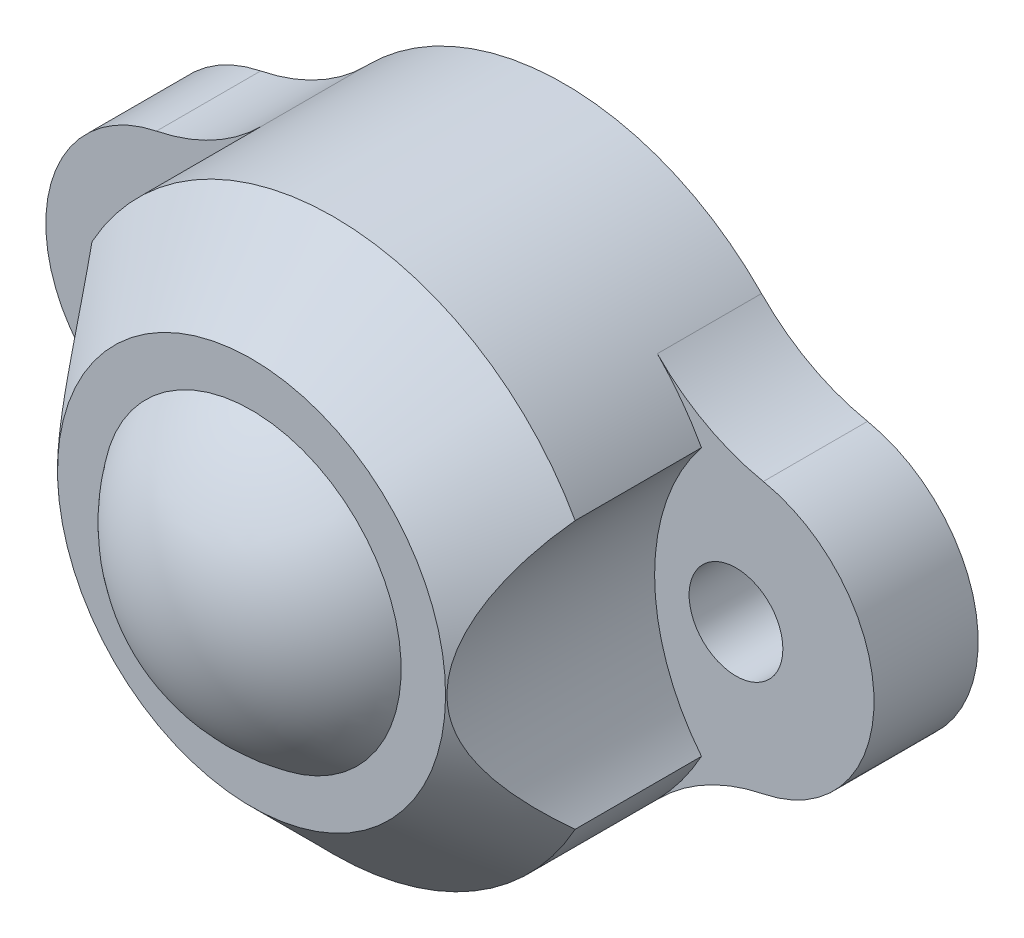
ISO-10303-21;
HEADER;
FILE_DESCRIPTION(('STEP AP214'),'2;1');
FILE_NAME('part.step','',(''),(''),'','','');
FILE_SCHEMA(('AUTOMOTIVE_DESIGN { 1 0 10303 214 1 1 1 1 }'));
ENDSEC;
DATA;
#1=APPLICATION_CONTEXT('core data for automotive mechanical design processes');
#2=APPLICATION_PROTOCOL_DEFINITION('international standard','automotive_design',2000,#1);
#3=PRODUCT_CONTEXT('',#1,'mechanical');
#4=PRODUCT('Part','Part','',(#3));
#5=PRODUCT_RELATED_PRODUCT_CATEGORY('part','',(#4));
#6=PRODUCT_DEFINITION_FORMATION('','',#4);
#7=PRODUCT_DEFINITION_CONTEXT('part definition',#1,'design');
#8=PRODUCT_DEFINITION('design','',#6,#7);
#9=PRODUCT_DEFINITION_SHAPE('','',#8);
#10=(LENGTH_UNIT() NAMED_UNIT(*) SI_UNIT(.MILLI.,.METRE.));
#11=(NAMED_UNIT(*) PLANE_ANGLE_UNIT() SI_UNIT($,.RADIAN.));
#12=(NAMED_UNIT(*) SI_UNIT($,.STERADIAN.) SOLID_ANGLE_UNIT());
#13=UNCERTAINTY_MEASURE_WITH_UNIT(LENGTH_MEASURE(1.E-05),#10,'distance_accuracy_value','');
#14=(GEOMETRIC_REPRESENTATION_CONTEXT(3) GLOBAL_UNCERTAINTY_ASSIGNED_CONTEXT((#13)) GLOBAL_UNIT_ASSIGNED_CONTEXT((#10,
#11,#12)) REPRESENTATION_CONTEXT('',''));
#15=CARTESIAN_POINT('',(0.,0.,0.));
#16=DIRECTION('',(0.,0.,1.));
#17=DIRECTION('',(1.,0.,0.));
#18=AXIS2_PLACEMENT_3D('',#15,#16,#17);
#19=CARTESIAN_POINT('',(-3.3655,0.,2.54));
#20=DIRECTION('',(0.,0.,1.));
#21=DIRECTION('',(1.,0.,0.));
#22=AXIS2_PLACEMENT_3D('',#19,#20,#21);
#23=PLANE('',#22);
#24=CARTESIAN_POINT('',(6.731,0.,2.54));
#25=DIRECTION('',(0.,0.,1.));
#26=DIRECTION('',(1.,0.,0.));
#27=AXIS2_PLACEMENT_3D('',#24,#25,#26);
#28=CIRCLE('',#27,1.143);
#29=CARTESIAN_POINT('',(7.874,0.,2.54));
#30=VERTEX_POINT('',#29);
#31=EDGE_CURVE('E165',#30,#30,#28,.T.);
#32=ORIENTED_EDGE('',*,*,#31,.F.);
#33=EDGE_LOOP('',(#32));
#34=FACE_BOUND('',#33,.T.);
#35=CARTESIAN_POINT('',(9.96381315724373,0.,2.54));
#36=DIRECTION('',(0.,0.,-1.));
#37=DIRECTION('',(-1.,0.,0.));
#38=AXIS2_PLACEMENT_3D('',#35,#36,#37);
#39=CIRCLE('',#38,5.21705736023671);
#40=CARTESIAN_POINT('',(5.889625,-3.25863136291527,2.54));
#41=VERTEX_POINT('',#40);
#42=CARTESIAN_POINT('',(5.889625,3.25863136291527,2.54));
#43=VERTEX_POINT('',#42);
#44=EDGE_CURVE('E156',#41,#43,#39,.T.);
#45=ORIENTED_EDGE('',*,*,#44,.F.);
#46=CARTESIAN_POINT('',(0.,0.,2.54));
#47=DIRECTION('',(0.,0.,1.));
#48=DIRECTION('',(1.,0.,0.));
#49=AXIS2_PLACEMENT_3D('',#46,#47,#48);
#50=CIRCLE('',#49,6.731);
#51=CARTESIAN_POINT('',(4.8137896065979,-4.7046562704846,2.54));
#52=VERTEX_POINT('',#51);
#53=EDGE_CURVE('E216',#52,#41,#50,.T.);
#54=ORIENTED_EDGE('',*,*,#53,.F.);
#55=CARTESIAN_POINT('',(8.389625,-8.19942396509505,2.54));
#56=DIRECTION('',(0.,0.,1.));
#57=DIRECTION('',(1.,0.,0.));
#58=AXIS2_PLACEMENT_3D('',#55,#56,#57);
#59=CIRCLE('',#58,5.);
#60=CARTESIAN_POINT('',(7.39827660480545,-3.29868643291225,2.54));
#61=VERTEX_POINT('',#60);
#62=EDGE_CURVE('E232',#52,#61,#59,.F.);
#63=ORIENTED_EDGE('',*,*,#62,.T.);
#64=CARTESIAN_POINT('',(6.731,0.,2.54));
#65=DIRECTION('',(0.,0.,1.));
#66=DIRECTION('',(1.,0.,0.));
#67=AXIS2_PLACEMENT_3D('',#64,#65,#66);
#68=CIRCLE('',#67,3.3655);
#69=CARTESIAN_POINT('',(7.39827660480545,3.29868643291225,2.54));
#70=VERTEX_POINT('',#69);
#71=EDGE_CURVE('E180',#61,#70,#68,.T.);
#72=ORIENTED_EDGE('',*,*,#71,.T.);
#73=CARTESIAN_POINT('',(8.389625,8.19942396509505,2.54));
#74=DIRECTION('',(0.,0.,1.));
#75=DIRECTION('',(1.,0.,0.));
#76=AXIS2_PLACEMENT_3D('',#73,#74,#75);
#77=CIRCLE('',#76,5.);
#78=CARTESIAN_POINT('',(4.8137896065979,4.7046562704846,2.54));
#79=VERTEX_POINT('',#78);
#80=EDGE_CURVE('E228',#70,#79,#77,.F.);
#81=ORIENTED_EDGE('',*,*,#80,.T.);
#82=CARTESIAN_POINT('',(0.,0.,2.54));
#83=DIRECTION('',(0.,0.,1.));
#84=DIRECTION('',(1.,0.,0.));
#85=AXIS2_PLACEMENT_3D('',#82,#83,#84);
#86=CIRCLE('',#85,6.731);
#87=EDGE_CURVE('E201',#43,#79,#86,.T.);
#88=ORIENTED_EDGE('',*,*,#87,.F.);
#89=EDGE_LOOP('',(#45,#54,#63,#72,#81,#88));
#90=FACE_BOUND('',#89,.T.);
#91=ADVANCED_FACE('F37',(#34,#90),#23,.T.);
#92=CARTESIAN_POINT('',(-6.731,0.,2.54));
#93=DIRECTION('',(0.,0.,1.));
#94=DIRECTION('',(1.,0.,0.));
#95=AXIS2_PLACEMENT_3D('',#92,#93,#94);
#96=CIRCLE('',#95,1.143);
#97=CARTESIAN_POINT('',(-5.588,0.,2.54));
#98=VERTEX_POINT('',#97);
#99=EDGE_CURVE('E171',#98,#98,#96,.T.);
#100=ORIENTED_EDGE('',*,*,#99,.F.);
#101=EDGE_LOOP('',(#100));
#102=FACE_BOUND('',#101,.T.);
#103=CARTESIAN_POINT('',(-9.96381315724373,0.,2.54));
#104=DIRECTION('',(0.,0.,-1.));
#105=DIRECTION('',(1.,0.,0.));
#106=AXIS2_PLACEMENT_3D('',#103,#104,#105);
#107=CIRCLE('',#106,5.21705736023671);
#108=CARTESIAN_POINT('',(-5.889625,3.25863136291527,2.54));
#109=VERTEX_POINT('',#108);
#110=CARTESIAN_POINT('',(-5.889625,-3.25863136291527,2.54));
#111=VERTEX_POINT('',#110);
#112=EDGE_CURVE('E136',#109,#111,#107,.T.);
#113=ORIENTED_EDGE('',*,*,#112,.F.);
#114=CARTESIAN_POINT('',(0.,0.,2.54));
#115=DIRECTION('',(0.,0.,1.));
#116=DIRECTION('',(1.,0.,0.));
#117=AXIS2_PLACEMENT_3D('',#114,#115,#116);
#118=CIRCLE('',#117,6.731);
#119=CARTESIAN_POINT('',(-4.8137896065979,4.7046562704846,2.54));
#120=VERTEX_POINT('',#119);
#121=EDGE_CURVE('E142',#120,#109,#118,.T.);
#122=ORIENTED_EDGE('',*,*,#121,.F.);
#123=CARTESIAN_POINT('',(-8.389625,8.19942396509505,2.54));
#124=DIRECTION('',(0.,0.,1.));
#125=DIRECTION('',(1.,0.,0.));
#126=AXIS2_PLACEMENT_3D('',#123,#124,#125);
#127=CIRCLE('',#126,5.);
#128=CARTESIAN_POINT('',(-7.39827660480545,3.29868643291225,2.54));
#129=VERTEX_POINT('',#128);
#130=EDGE_CURVE('E224',#120,#129,#127,.F.);
#131=ORIENTED_EDGE('',*,*,#130,.T.);
#132=CARTESIAN_POINT('',(-6.731,0.,2.54));
#133=DIRECTION('',(0.,0.,1.));
#134=DIRECTION('',(1.,0.,0.));
#135=AXIS2_PLACEMENT_3D('',#132,#133,#134);
#136=CIRCLE('',#135,3.3655);
#137=CARTESIAN_POINT('',(-7.39827660480545,-3.29868643291225,2.54));
#138=VERTEX_POINT('',#137);
#139=EDGE_CURVE('E177',#129,#138,#136,.T.);
#140=ORIENTED_EDGE('',*,*,#139,.T.);
#141=CARTESIAN_POINT('',(-8.389625,-8.19942396509505,2.54));
#142=DIRECTION('',(0.,0.,1.));
#143=DIRECTION('',(1.,0.,0.));
#144=AXIS2_PLACEMENT_3D('',#141,#142,#143);
#145=CIRCLE('',#144,5.);
#146=CARTESIAN_POINT('',(-4.8137896065979,-4.7046562704846,2.54));
#147=VERTEX_POINT('',#146);
#148=EDGE_CURVE('E236',#138,#147,#145,.F.);
#149=ORIENTED_EDGE('',*,*,#148,.T.);
#150=CARTESIAN_POINT('',(0.,0.,2.54));
#151=DIRECTION('',(0.,0.,1.));
#152=DIRECTION('',(1.,0.,0.));
#153=AXIS2_PLACEMENT_3D('',#150,#151,#152);
#154=CIRCLE('',#153,6.731);
#155=EDGE_CURVE('E154',#111,#147,#154,.T.);
#156=ORIENTED_EDGE('',*,*,#155,.F.);
#157=EDGE_LOOP('',(#113,#122,#131,#140,#149,#156));
#158=FACE_BOUND('',#157,.T.);
#159=ADVANCED_FACE('F152',(#102,#158),#23,.T.);
#160=CARTESIAN_POINT('',(-3.3655,0.,0.));
#161=DIRECTION('',(0.,0.,1.));
#162=DIRECTION('',(1.,0.,0.));
#163=AXIS2_PLACEMENT_3D('',#160,#161,#162);
#164=PLANE('',#163);
#165=CARTESIAN_POINT('',(0.,0.,0.));
#166=DIRECTION('',(0.,0.,1.));
#167=DIRECTION('',(1.,0.,0.));
#168=AXIS2_PLACEMENT_3D('',#165,#166,#167);
#169=CIRCLE('',#168,6.731);
#170=CARTESIAN_POINT('',(4.8137896065979,4.7046562704846,0.));
#171=VERTEX_POINT('',#170);
#172=CARTESIAN_POINT('',(-4.8137896065979,4.7046562704846,0.));
#173=VERTEX_POINT('',#172);
#174=EDGE_CURVE('E174',#171,#173,#169,.T.);
#175=ORIENTED_EDGE('',*,*,#174,.F.);
#176=CARTESIAN_POINT('',(8.389625,8.19942396509505,0.));
#177=DIRECTION('',(0.,0.,1.));
#178=DIRECTION('',(1.,0.,0.));
#179=AXIS2_PLACEMENT_3D('',#176,#177,#178);
#180=CIRCLE('',#179,5.);
#181=CARTESIAN_POINT('',(7.39827660480545,3.29868643291225,0.));
#182=VERTEX_POINT('',#181);
#183=EDGE_CURVE('E226',#171,#182,#180,.T.);
#184=ORIENTED_EDGE('',*,*,#183,.T.);
#185=CARTESIAN_POINT('',(6.731,0.,0.));
#186=DIRECTION('',(0.,0.,1.));
#187=DIRECTION('',(1.,0.,0.));
#188=AXIS2_PLACEMENT_3D('',#185,#186,#187);
#189=CIRCLE('',#188,3.3655);
#190=CARTESIAN_POINT('',(7.39827660480545,-3.29868643291225,0.));
#191=VERTEX_POINT('',#190);
#192=EDGE_CURVE('E181',#191,#182,#189,.T.);
#193=ORIENTED_EDGE('',*,*,#192,.F.);
#194=CARTESIAN_POINT('',(8.389625,-8.19942396509505,0.));
#195=DIRECTION('',(0.,0.,1.));
#196=DIRECTION('',(1.,0.,0.));
#197=AXIS2_PLACEMENT_3D('',#194,#195,#196);
#198=CIRCLE('',#197,5.);
#199=CARTESIAN_POINT('',(4.8137896065979,-4.7046562704846,0.));
#200=VERTEX_POINT('',#199);
#201=EDGE_CURVE('E230',#191,#200,#198,.T.);
#202=ORIENTED_EDGE('',*,*,#201,.T.);
#203=CARTESIAN_POINT('',(0.,0.,0.));
#204=DIRECTION('',(0.,0.,1.));
#205=DIRECTION('',(1.,0.,0.));
#206=AXIS2_PLACEMENT_3D('',#203,#204,#205);
#207=CIRCLE('',#206,6.731);
#208=CARTESIAN_POINT('',(-4.8137896065979,-4.7046562704846,0.));
#209=VERTEX_POINT('',#208);
#210=EDGE_CURVE('E189',#209,#200,#207,.T.);
#211=ORIENTED_EDGE('',*,*,#210,.F.);
#212=CARTESIAN_POINT('',(-8.389625,-8.19942396509505,0.));
#213=DIRECTION('',(0.,0.,1.));
#214=DIRECTION('',(1.,0.,0.));
#215=AXIS2_PLACEMENT_3D('',#212,#213,#214);
#216=CIRCLE('',#215,5.);
#217=CARTESIAN_POINT('',(-7.39827660480545,-3.29868643291225,0.));
#218=VERTEX_POINT('',#217);
#219=EDGE_CURVE('E234',#209,#218,#216,.T.);
#220=ORIENTED_EDGE('',*,*,#219,.T.);
#221=CARTESIAN_POINT('',(-6.731,0.,0.));
#222=DIRECTION('',(0.,0.,1.));
#223=DIRECTION('',(1.,0.,0.));
#224=AXIS2_PLACEMENT_3D('',#221,#222,#223);
#225=CIRCLE('',#224,3.3655);
#226=CARTESIAN_POINT('',(-7.39827660480545,3.29868643291225,0.));
#227=VERTEX_POINT('',#226);
#228=EDGE_CURVE('E186',#227,#218,#225,.T.);
#229=ORIENTED_EDGE('',*,*,#228,.F.);
#230=CARTESIAN_POINT('',(-8.389625,8.19942396509505,0.));
#231=DIRECTION('',(0.,0.,1.));
#232=DIRECTION('',(1.,0.,0.));
#233=AXIS2_PLACEMENT_3D('',#230,#231,#232);
#234=CIRCLE('',#233,5.);
#235=EDGE_CURVE('E222',#227,#173,#234,.T.);
#236=ORIENTED_EDGE('',*,*,#235,.T.);
#237=EDGE_LOOP('',(#175,#184,#193,#202,#211,#220,#229,#236));
#238=FACE_BOUND('',#237,.T.);
#239=CARTESIAN_POINT('',(-6.731,0.,0.));
#240=DIRECTION('',(0.,0.,1.));
#241=DIRECTION('',(1.,0.,0.));
#242=AXIS2_PLACEMENT_3D('',#239,#240,#241);
#243=CIRCLE('',#242,1.143);
#244=CARTESIAN_POINT('',(-5.588,0.,0.));
#245=VERTEX_POINT('',#244);
#246=EDGE_CURVE('E168',#245,#245,#243,.T.);
#247=ORIENTED_EDGE('',*,*,#246,.T.);
#248=EDGE_LOOP('',(#247));
#249=FACE_BOUND('',#248,.T.);
#250=CARTESIAN_POINT('',(6.731,0.,0.));
#251=DIRECTION('',(0.,0.,1.));
#252=DIRECTION('',(1.,0.,0.));
#253=AXIS2_PLACEMENT_3D('',#250,#251,#252);
#254=CIRCLE('',#253,1.143);
#255=CARTESIAN_POINT('',(7.874,0.,0.));
#256=VERTEX_POINT('',#255);
#257=EDGE_CURVE('E164',#256,#256,#254,.T.);
#258=ORIENTED_EDGE('',*,*,#257,.T.);
#259=EDGE_LOOP('',(#258));
#260=FACE_BOUND('',#259,.T.);
#261=ADVANCED_FACE('F268',(#238,#249,#260),#164,.F.);
#262=CARTESIAN_POINT('',(0.,0.,2.54));
#263=DIRECTION('',(0.,0.,-1.));
#264=DIRECTION('',(-1.,0.,0.));
#265=AXIS2_PLACEMENT_3D('',#262,#263,#264);
#266=CYLINDRICAL_SURFACE('',#265,6.731);
#267=DIRECTION('',(0.,0.,-1.));
#268=VECTOR('',#267,1.);
#269=CARTESIAN_POINT('',(-5.889625,3.25863136291527,7.62));
#270=LINE('',#269,#268);
#271=CARTESIAN_POINT('',(-5.889625,3.25863136291527,5.61999999999999));
#272=VERTEX_POINT('',#271);
#273=EDGE_CURVE('E131',#272,#109,#270,.T.);
#274=ORIENTED_EDGE('',*,*,#273,.F.);
#275=CARTESIAN_POINT('',(0.,0.,5.61999999999999));
#276=DIRECTION('',(0.,0.,-1.));
#277=DIRECTION('',(-1.,0.,0.));
#278=AXIS2_PLACEMENT_3D('',#275,#276,#277);
#279=CIRCLE('',#278,6.731);
#280=CARTESIAN_POINT('',(5.889625,3.25863136291527,5.61999999999999));
#281=VERTEX_POINT('',#280);
#282=EDGE_CURVE('E50',#272,#281,#279,.T.);
#283=ORIENTED_EDGE('',*,*,#282,.T.);
#284=DIRECTION('',(0.,0.,-1.));
#285=VECTOR('',#284,1.);
#286=CARTESIAN_POINT('',(5.889625,3.25863136291527,7.62));
#287=LINE('',#286,#285);
#288=EDGE_CURVE('E138',#281,#43,#287,.T.);
#289=ORIENTED_EDGE('',*,*,#288,.T.);
#290=ORIENTED_EDGE('',*,*,#87,.T.);
#291=DIRECTION('',(0.,0.,-1.));
#292=VECTOR('',#291,1.);
#293=CARTESIAN_POINT('',(4.8137896065979,4.7046562704846,2.54));
#294=LINE('',#293,#292);
#295=EDGE_CURVE('E149',#79,#171,#294,.T.);
#296=ORIENTED_EDGE('',*,*,#295,.T.);
#297=ORIENTED_EDGE('',*,*,#174,.T.);
#298=DIRECTION('',(0.,0.,-1.));
#299=VECTOR('',#298,1.);
#300=CARTESIAN_POINT('',(-4.8137896065979,4.7046562704846,2.54));
#301=LINE('',#300,#299);
#302=EDGE_CURVE('E146',#173,#120,#301,.F.);
#303=ORIENTED_EDGE('',*,*,#302,.T.);
#304=ORIENTED_EDGE('',*,*,#121,.T.);
#305=EDGE_LOOP('',(#274,#283,#289,#290,#296,#297,#303,#304));
#306=FACE_BOUND('',#305,.T.);
#307=ADVANCED_FACE('F143',(#306),#266,.T.);
#308=CARTESIAN_POINT('',(-6.731,0.,2.54));
#309=DIRECTION('',(0.,0.,-1.));
#310=DIRECTION('',(-1.,0.,0.));
#311=AXIS2_PLACEMENT_3D('',#308,#309,#310);
#312=CYLINDRICAL_SURFACE('',#311,3.3655);
#313=ORIENTED_EDGE('',*,*,#139,.F.);
#314=DIRECTION('',(0.,0.,-1.));
#315=VECTOR('',#314,1.);
#316=CARTESIAN_POINT('',(-7.39827660480545,3.29868643291225,2.54));
#317=LINE('',#316,#315);
#318=EDGE_CURVE('E198',#129,#227,#317,.T.);
#319=ORIENTED_EDGE('',*,*,#318,.T.);
#320=ORIENTED_EDGE('',*,*,#228,.T.);
#321=DIRECTION('',(0.,0.,-1.));
#322=VECTOR('',#321,1.);
#323=CARTESIAN_POINT('',(-7.39827660480545,-3.29868643291225,2.54));
#324=LINE('',#323,#322);
#325=EDGE_CURVE('E196',#218,#138,#324,.F.);
#326=ORIENTED_EDGE('',*,*,#325,.T.);
#327=EDGE_LOOP('',(#313,#319,#320,#326));
#328=FACE_BOUND('',#327,.T.);
#329=ADVANCED_FACE('F278',(#328),#312,.T.);
#330=CARTESIAN_POINT('',(0.,0.,2.54));
#331=DIRECTION('',(0.,0.,-1.));
#332=DIRECTION('',(-1.,0.,0.));
#333=AXIS2_PLACEMENT_3D('',#330,#331,#332);
#334=CYLINDRICAL_SURFACE('',#333,6.731);
#335=DIRECTION('',(0.,0.,-1.));
#336=VECTOR('',#335,1.);
#337=CARTESIAN_POINT('',(5.889625,-3.25863136291527,7.62));
#338=LINE('',#337,#336);
#339=CARTESIAN_POINT('',(5.889625,-3.25863136291527,5.62000000000006));
#340=VERTEX_POINT('',#339);
#341=EDGE_CURVE('E155',#340,#41,#338,.T.);
#342=ORIENTED_EDGE('',*,*,#341,.F.);
#343=CARTESIAN_POINT('',(0.,0.,5.61999999999999));
#344=DIRECTION('',(0.,0.,-1.));
#345=DIRECTION('',(-1.,0.,0.));
#346=AXIS2_PLACEMENT_3D('',#343,#344,#345);
#347=CIRCLE('',#346,6.731);
#348=CARTESIAN_POINT('',(-5.889625,-3.25863136291527,5.61999999999999));
#349=VERTEX_POINT('',#348);
#350=EDGE_CURVE('E239',#340,#349,#347,.T.);
#351=ORIENTED_EDGE('',*,*,#350,.T.);
#352=DIRECTION('',(0.,0.,-1.));
#353=VECTOR('',#352,1.);
#354=CARTESIAN_POINT('',(-5.889625,-3.25863136291527,7.62));
#355=LINE('',#354,#353);
#356=EDGE_CURVE('E139',#349,#111,#355,.T.);
#357=ORIENTED_EDGE('',*,*,#356,.T.);
#358=ORIENTED_EDGE('',*,*,#155,.T.);
#359=DIRECTION('',(0.,0.,-1.));
#360=VECTOR('',#359,1.);
#361=CARTESIAN_POINT('',(-4.8137896065979,-4.7046562704846,2.54));
#362=LINE('',#361,#360);
#363=EDGE_CURVE('E213',#147,#209,#362,.T.);
#364=ORIENTED_EDGE('',*,*,#363,.T.);
#365=ORIENTED_EDGE('',*,*,#210,.T.);
#366=DIRECTION('',(0.,0.,-1.));
#367=VECTOR('',#366,1.);
#368=CARTESIAN_POINT('',(4.8137896065979,-4.7046562704846,2.54));
#369=LINE('',#368,#367);
#370=EDGE_CURVE('E219',#200,#52,#369,.F.);
#371=ORIENTED_EDGE('',*,*,#370,.T.);
#372=ORIENTED_EDGE('',*,*,#53,.T.);
#373=EDGE_LOOP('',(#342,#351,#357,#358,#364,#365,#371,#372));
#374=FACE_BOUND('',#373,.T.);
#375=ADVANCED_FACE('F274',(#374),#334,.T.);
#376=CARTESIAN_POINT('',(6.731,0.,2.54));
#377=DIRECTION('',(0.,0.,-1.));
#378=DIRECTION('',(-1.,0.,0.));
#379=AXIS2_PLACEMENT_3D('',#376,#377,#378);
#380=CYLINDRICAL_SURFACE('',#379,3.3655);
#381=ORIENTED_EDGE('',*,*,#192,.T.);
#382=DIRECTION('',(0.,0.,-1.));
#383=VECTOR('',#382,1.);
#384=CARTESIAN_POINT('',(7.39827660480545,3.29868643291225,2.54));
#385=LINE('',#384,#383);
#386=EDGE_CURVE('E210',#182,#70,#385,.F.);
#387=ORIENTED_EDGE('',*,*,#386,.T.);
#388=ORIENTED_EDGE('',*,*,#71,.F.);
#389=DIRECTION('',(0.,0.,-1.));
#390=VECTOR('',#389,1.);
#391=CARTESIAN_POINT('',(7.39827660480545,-3.29868643291225,2.54));
#392=LINE('',#391,#390);
#393=EDGE_CURVE('E207',#61,#191,#392,.T.);
#394=ORIENTED_EDGE('',*,*,#393,.T.);
#395=EDGE_LOOP('',(#381,#387,#388,#394));
#396=FACE_BOUND('',#395,.T.);
#397=ADVANCED_FACE('F263',(#396),#380,.T.);
#398=CARTESIAN_POINT('',(-6.731,0.,2.54));
#399=DIRECTION('',(0.,0.,-1.));
#400=DIRECTION('',(-1.,0.,0.));
#401=AXIS2_PLACEMENT_3D('',#398,#399,#400);
#402=CYLINDRICAL_SURFACE('',#401,1.143);
#403=ORIENTED_EDGE('',*,*,#99,.T.);
#404=EDGE_LOOP('',(#403));
#405=FACE_BOUND('',#404,.T.);
#406=ORIENTED_EDGE('',*,*,#246,.F.);
#407=EDGE_LOOP('',(#406));
#408=FACE_BOUND('',#407,.T.);
#409=ADVANCED_FACE('F259',(#405,#408),#402,.F.);
#410=CARTESIAN_POINT('',(6.731,0.,2.54));
#411=DIRECTION('',(0.,0.,-1.));
#412=DIRECTION('',(-1.,0.,0.));
#413=AXIS2_PLACEMENT_3D('',#410,#411,#412);
#414=CYLINDRICAL_SURFACE('',#413,1.143);
#415=ORIENTED_EDGE('',*,*,#31,.T.);
#416=EDGE_LOOP('',(#415));
#417=FACE_BOUND('',#416,.T.);
#418=ORIENTED_EDGE('',*,*,#257,.F.);
#419=EDGE_LOOP('',(#418));
#420=FACE_BOUND('',#419,.T.);
#421=ADVANCED_FACE('F255',(#417,#420),#414,.F.);
#422=CARTESIAN_POINT('',(9.96381315724373,0.,7.62));
#423=DIRECTION('',(0.,0.,-1.));
#424=DIRECTION('',(-1.,0.,0.));
#425=AXIS2_PLACEMENT_3D('',#422,#423,#424);
#426=CYLINDRICAL_SURFACE('',#425,5.21705736023671);
#427=ORIENTED_EDGE('',*,*,#288,.F.);
#428=CARTESIAN_POINT('',(5.889625,3.25863136291527,5.61999999999999));
#429=CARTESIAN_POINT('',(5.85186598769293,3.21141976454037,5.67589309072123));
#430=CARTESIAN_POINT('',(5.81476696504133,3.16335618640523,5.73150789218911));
#431=CARTESIAN_POINT('',(5.74192272000934,3.06546151424885,5.8420784023594));
#432=CARTESIAN_POINT('',(5.70617765922462,3.015630210615,5.89703403185796));
#433=CARTESIAN_POINT('',(5.60085446748525,2.86314162946394,6.06102333053936));
#434=CARTESIAN_POINT('',(5.53338587288681,2.75773552915929,6.16888646017654));
#435=CARTESIAN_POINT('',(5.40363445229679,2.53752245950714,6.3816457467042));
#436=CARTESIAN_POINT('',(5.3414360704946,2.42260580235929,6.48648039104259));
#437=CARTESIAN_POINT('',(5.2239965045222,2.18391982809885,6.68952967619423));
#438=CARTESIAN_POINT('',(5.16874694676357,2.06016145326533,6.78775221716029));
#439=CARTESIAN_POINT('',(5.06658389618765,1.80379513610964,6.97385670315782));
#440=CARTESIAN_POINT('',(5.01959398244953,1.67128585762043,7.06183059178024));
#441=CARTESIAN_POINT('',(4.93478946442931,1.39550018898942,7.22407961559049));
#442=CARTESIAN_POINT('',(4.89696113231895,1.25224033490945,7.29837520594148));
#443=CARTESIAN_POINT('',(4.83197921706732,0.951745964558499,7.42816301449603));
#444=CARTESIAN_POINT('',(4.80500928173202,0.794322037691265,7.48332971327298));
#445=CARTESIAN_POINT('',(4.77536924571675,0.55171603339234,7.54451462036162));
#446=CARTESIAN_POINT('',(4.76729446088302,0.469855992740416,7.56130920824298));
#447=CARTESIAN_POINT('',(4.75499809369391,0.304598237371093,7.58695671353878));
#448=CARTESIAN_POINT('',(4.75077549722451,0.221200933249966,7.59581172108962));
#449=CARTESIAN_POINT('',(4.74663873828431,0.0643433870921131,7.60448824144649));
#450=CARTESIAN_POINT('',(4.74625040968193,-0.00905054760639841,7.60530391507223));
#451=CARTESIAN_POINT('',(4.74856013538346,-0.15558580961644,7.60045828230687));
#452=CARTESIAN_POINT('',(4.75125922334812,-0.228727044099256,7.59479480670979));
#453=CARTESIAN_POINT('',(4.76389681249666,-0.446872052691331,7.56836193431834));
#454=CARTESIAN_POINT('',(4.77837689878139,-0.590546125438683,7.53814750626334));
#455=CARTESIAN_POINT('',(4.82224229520938,-0.900997101350528,7.44811232618468));
#456=CARTESIAN_POINT('',(4.85421407391124,-1.06586427345134,7.38322497502462));
#457=CARTESIAN_POINT('',(4.93061917121656,-1.382502389371,7.23227611453262));
#458=CARTESIAN_POINT('',(4.97508346904179,-1.53423953368715,7.14616203264799));
#459=CARTESIAN_POINT('',(5.06871289949225,-1.80955053873394,6.97006483820903));
#460=CARTESIAN_POINT('',(5.11686117134296,-1.93439916188169,6.88148916203805));
#461=CARTESIAN_POINT('',(5.22007326025857,-2.17526982908309,6.69659099549704));
#462=CARTESIAN_POINT('',(5.27514250423308,-2.29128483056188,6.60026244745498));
#463=CARTESIAN_POINT('',(5.39167986918211,-2.51582039548657,6.40176489551305));
#464=CARTESIAN_POINT('',(5.45317609709573,-2.62430426580177,6.29957120060666));
#465=CARTESIAN_POINT('',(5.58181633541269,-2.83388340488484,6.09134149488048));
#466=CARTESIAN_POINT('',(5.64895918335376,-2.93498018645287,5.98530627745599));
#467=CARTESIAN_POINT('',(5.83752415812074,-3.19894168436202,5.69506699035582));
#468=CARTESIAN_POINT('',(5.96396929974148,-3.35536107871374,5.50823019073632));
#469=CARTESIAN_POINT('',(6.23085905365125,-3.64996444205274,5.13004254896389));
#470=CARTESIAN_POINT('',(6.37131585219103,-3.78813229024797,4.93868788988405));
#471=CARTESIAN_POINT('',(6.66217219239553,-4.04395707016557,4.55760813376808));
#472=CARTESIAN_POINT('',(6.81231633830202,-4.16196929783284,4.36792712609931));
#473=CARTESIAN_POINT('',(7.04592738222436,-4.3258124232285,4.08312613153551));
#474=CARTESIAN_POINT('',(7.12513368491213,-4.37819621559652,3.98821790074098));
#475=CARTESIAN_POINT('',(7.28626905674265,-4.47855417588387,3.79838803125242));
#476=CARTESIAN_POINT('',(7.36819802962479,-4.5265284994756,3.70346639315029));
#477=CARTESIAN_POINT('',(7.45143804104195,-4.57227063672855,3.60859829023068));
#478=B_SPLINE_CURVE_WITH_KNOTS('',3,(#428,#429,#430,#431,#432,#433,#434,#435,#436,#437,#438,
#439,#440,#441,#442,#443,#444,#445,#446,#447,#448,#449,#450,#451,#452,#453,#454,#455,#456,#457,
#458,#459,#460,#461,#462,#463,#464,#465,#466,#467,#468,#469,#470,#471,#472,#473,#474,#475,#476,
#477),.UNSPECIFIED.,.F.,.F.,(4,2,2,2,2,2,2,2,2,2,2,2,2,2,2,2,2,2,2,2,2,2,2,2,4),(0.,
0.246983686732904,0.493996758736756,0.989312323564042,1.49146548240391,1.99300760937196,
2.48963229645142,2.98550816588013,3.48945010276534,3.74090746136356,3.99229860303311,
4.21214289468016,4.43206081129402,4.8720472721645,5.40925191059025,5.9478006608909,
6.42854306041249,6.90966480207928,7.3929864278892,7.87620879534694,8.69856593216257,
9.52164463238129,10.3282428172814,10.7309321599659,11.1336072805941),.UNSPECIFIED.);
#479=EDGE_CURVE('E11',#281,#340,#478,.T.);
#480=ORIENTED_EDGE('',*,*,#479,.T.);
#481=ORIENTED_EDGE('',*,*,#341,.T.);
#482=ORIENTED_EDGE('',*,*,#44,.T.);
#483=EDGE_LOOP('',(#427,#480,#481,#482));
#484=FACE_BOUND('',#483,.T.);
#485=ADVANCED_FACE('F250',(#484),#426,.F.);
#486=CARTESIAN_POINT('',(-9.96381315724373,0.,7.62));
#487=DIRECTION('',(0.,0.,-1.));
#488=DIRECTION('',(-1.,0.,0.));
#489=AXIS2_PLACEMENT_3D('',#486,#487,#488);
#490=CYLINDRICAL_SURFACE('',#489,5.21705736023671);
#491=ORIENTED_EDGE('',*,*,#356,.F.);
#492=CARTESIAN_POINT('',(-5.889625,-3.25863136291527,5.61999999999999));
#493=CARTESIAN_POINT('',(-5.85186598769294,-3.21141976454037,5.67589309072123));
#494=CARTESIAN_POINT('',(-5.81476696504133,-3.16335618640523,5.73150789218911));
#495=CARTESIAN_POINT('',(-5.74192272000934,-3.06546151424885,5.8420784023594));
#496=CARTESIAN_POINT('',(-5.70617765922462,-3.015630210615,5.89703403185796));
#497=CARTESIAN_POINT('',(-5.60085446748526,-2.86314162946394,6.06102333053936));
#498=CARTESIAN_POINT('',(-5.53338587288682,-2.75773552915929,6.16888646017654));
#499=CARTESIAN_POINT('',(-5.40363445229679,-2.53752245950714,6.3816457467042));
#500=CARTESIAN_POINT('',(-5.34143607049461,-2.42260580235929,6.48648039104259));
#501=CARTESIAN_POINT('',(-5.2239965045222,-2.18391982809885,6.68952967619423));
#502=CARTESIAN_POINT('',(-5.16874694676357,-2.06016145326533,6.78775221716028));
#503=CARTESIAN_POINT('',(-5.06658389618765,-1.80379513610964,6.97385670315781));
#504=CARTESIAN_POINT('',(-5.01959398244954,-1.67128585762043,7.06183059178024));
#505=CARTESIAN_POINT('',(-4.93478946442931,-1.39550018898942,7.22407961559049));
#506=CARTESIAN_POINT('',(-4.89696113231895,-1.25224033490945,7.29837520594148));
#507=CARTESIAN_POINT('',(-4.83197921706732,-0.951745964558498,7.42816301449603));
#508=CARTESIAN_POINT('',(-4.80500928173202,-0.794322037691265,7.48332971327298));
#509=CARTESIAN_POINT('',(-4.77536924571675,-0.551716033392339,7.54451462036162));
#510=CARTESIAN_POINT('',(-4.76729446088302,-0.469855992740415,7.56130920824298));
#511=CARTESIAN_POINT('',(-4.75499809369391,-0.304598237371091,7.58695671353878));
#512=CARTESIAN_POINT('',(-4.75077549722451,-0.221200933249964,7.59581172108962));
#513=CARTESIAN_POINT('',(-4.74663873828431,-0.064343387092112,7.60448824144648));
#514=CARTESIAN_POINT('',(-4.74625040968193,0.00905054760639956,7.60530391507223));
#515=CARTESIAN_POINT('',(-4.74856013538346,0.155585809616441,7.60045828230687));
#516=CARTESIAN_POINT('',(-4.75125922334812,0.228727044099257,7.59479480670979));
#517=CARTESIAN_POINT('',(-4.76389681249666,0.446872052691331,7.56836193431834));
#518=CARTESIAN_POINT('',(-4.77837689878139,0.590546125438683,7.53814750626334));
#519=CARTESIAN_POINT('',(-4.82224229520939,0.900997101350528,7.44811232618468));
#520=CARTESIAN_POINT('',(-4.85421407391124,1.06586427345134,7.38322497502462));
#521=CARTESIAN_POINT('',(-4.93061917121656,1.382502389371,7.23227611453262));
#522=CARTESIAN_POINT('',(-4.97508346904179,1.53423953368715,7.14616203264799));
#523=CARTESIAN_POINT('',(-5.06871289949225,1.80955053873394,6.97006483820903));
#524=CARTESIAN_POINT('',(-5.11686117134296,1.93439916188169,6.88148916203805));
#525=CARTESIAN_POINT('',(-5.22007326025857,2.17526982908309,6.69659099549704));
#526=CARTESIAN_POINT('',(-5.27514250423308,2.29128483056188,6.60026244745498));
#527=CARTESIAN_POINT('',(-5.39167986918211,2.51582039548658,6.40176489551305));
#528=CARTESIAN_POINT('',(-5.45317609709573,2.62430426580177,6.29957120060666));
#529=CARTESIAN_POINT('',(-5.58181633541269,2.83388340488484,6.09134149488048));
#530=CARTESIAN_POINT('',(-5.64895918335376,2.93498018645287,5.98530627745599));
#531=CARTESIAN_POINT('',(-5.83752415812074,3.19894168436202,5.69506699035582));
#532=CARTESIAN_POINT('',(-5.96396929974148,3.35536107871374,5.50823019073632));
#533=CARTESIAN_POINT('',(-6.23085905365124,3.64996444205274,5.13004254896389));
#534=CARTESIAN_POINT('',(-6.37131585219103,3.78813229024797,4.93868788988405));
#535=CARTESIAN_POINT('',(-6.66217219239553,4.04395707016557,4.55760813376809));
#536=CARTESIAN_POINT('',(-6.81231633830202,4.16196929783284,4.36792712609931));
#537=CARTESIAN_POINT('',(-7.04592738222436,4.3258124232285,4.08312613153551));
#538=CARTESIAN_POINT('',(-7.12513368491213,4.37819621559652,3.98821790074099));
#539=CARTESIAN_POINT('',(-7.28626905674265,4.47855417588387,3.79838803125242));
#540=CARTESIAN_POINT('',(-7.36819802962478,4.5265284994756,3.7034663931503));
#541=CARTESIAN_POINT('',(-7.45143804104195,4.57227063672856,3.60859829023069));
#542=B_SPLINE_CURVE_WITH_KNOTS('',3,(#492,#493,#494,#495,#496,#497,#498,#499,#500,#501,#502,
#503,#504,#505,#506,#507,#508,#509,#510,#511,#512,#513,#514,#515,#516,#517,#518,#519,#520,#521,
#522,#523,#524,#525,#526,#527,#528,#529,#530,#531,#532,#533,#534,#535,#536,#537,#538,#539,#540,
#541),.UNSPECIFIED.,.F.,.F.,(4,2,2,2,2,2,2,2,2,2,2,2,2,2,2,2,2,2,2,2,2,2,2,2,4),(0.,
0.246983686732903,0.493996758736755,0.989312323564041,1.49146548240391,1.99300760937196,
2.48963229645142,2.98550816588013,3.48945010276534,3.74090746136356,3.99229860303311,
4.21214289468016,4.43206081129402,4.8720472721645,5.40925191059025,5.9478006608909,
6.42854306041249,6.90966480207928,7.3929864278892,7.87620879534694,8.69856593216256,
9.52164463238129,10.3282428172814,10.7309321599659,11.1336072805941),.UNSPECIFIED.);
#543=EDGE_CURVE('E137',#349,#272,#542,.T.);
#544=ORIENTED_EDGE('',*,*,#543,.T.);
#545=ORIENTED_EDGE('',*,*,#273,.T.);
#546=ORIENTED_EDGE('',*,*,#112,.T.);
#547=EDGE_LOOP('',(#491,#544,#545,#546));
#548=FACE_BOUND('',#547,.T.);
#549=ADVANCED_FACE('F134',(#548),#490,.F.);
#550=CARTESIAN_POINT('',(4.98190657862186,0.,7.62));
#551=DIRECTION('',(0.,0.,-1.));
#552=DIRECTION('',(-1.,0.,0.));
#553=AXIS2_PLACEMENT_3D('',#550,#551,#552);
#554=PLANE('',#553);
#555=CARTESIAN_POINT('',(0.,0.,7.62));
#556=DIRECTION('',(0.,0.,-1.));
#557=DIRECTION('',(-1.,0.,0.));
#558=AXIS2_PLACEMENT_3D('',#555,#556,#557);
#559=CIRCLE('',#558,4.73099999999999);
#560=CARTESIAN_POINT('',(-4.139625,-2.29038552636341,7.62));
#561=VERTEX_POINT('',#560);
#562=EDGE_CURVE('E55',#561,#561,#559,.F.);
#563=ORIENTED_EDGE('',*,*,#562,.T.);
#564=EDGE_LOOP('',(#563));
#565=FACE_BOUND('',#564,.T.);
#566=CARTESIAN_POINT('',(0.,0.,7.62));
#567=DIRECTION('',(0.,0.,-1.));
#568=DIRECTION('',(-1.,0.,0.));
#569=AXIS2_PLACEMENT_3D('',#566,#567,#568);
#570=CIRCLE('',#569,3.64779728055165);
#571=CARTESIAN_POINT('',(-3.64779728055165,0.,7.62));
#572=VERTEX_POINT('',#571);
#573=EDGE_CURVE('E184',#572,#572,#570,.F.);
#574=ORIENTED_EDGE('',*,*,#573,.F.);
#575=EDGE_LOOP('',(#574));
#576=FACE_BOUND('',#575,.T.);
#577=ADVANCED_FACE('F249',(#565,#576),#554,.F.);
#578=CARTESIAN_POINT('',(0.,0.,5.08));
#579=DIRECTION('',(-1.,0.,0.));
#580=DIRECTION('',(0.,-1.,0.));
#581=AXIS2_PLACEMENT_3D('',#578,#579,#580);
#582=SPHERICAL_SURFACE('',#581,4.445);
#583=CARTESIAN_POINT('',(0.,0.,5.08));
#584=DIRECTION('',(0.,0.,-1.));
#585=DIRECTION('',(-1.,0.,0.));
#586=AXIS2_PLACEMENT_3D('',#583,#584,#585);
#587=SPHERICAL_SURFACE('',#586,4.445);
#588=ORIENTED_EDGE('',*,*,#573,.T.);
#589=EDGE_LOOP('',(#588));
#590=FACE_BOUND('',#589,.T.);
#591=ADVANCED_FACE('F289',(#590),#587,.T.);
#592=CARTESIAN_POINT('',(-8.389625,8.19942396509505,2.54));
#593=DIRECTION('',(0.,0.,1.));
#594=DIRECTION('',(1.,0.,0.));
#595=AXIS2_PLACEMENT_3D('',#592,#593,#594);
#596=CYLINDRICAL_SURFACE('',#595,5.);
#597=ORIENTED_EDGE('',*,*,#130,.F.);
#598=ORIENTED_EDGE('',*,*,#302,.F.);
#599=ORIENTED_EDGE('',*,*,#235,.F.);
#600=ORIENTED_EDGE('',*,*,#318,.F.);
#601=EDGE_LOOP('',(#597,#598,#599,#600));
#602=FACE_BOUND('',#601,.T.);
#603=ADVANCED_FACE('F285',(#602),#596,.F.);
#604=CARTESIAN_POINT('',(8.389625,8.19942396509505,2.54));
#605=DIRECTION('',(0.,0.,1.));
#606=DIRECTION('',(1.,0.,0.));
#607=AXIS2_PLACEMENT_3D('',#604,#605,#606);
#608=CYLINDRICAL_SURFACE('',#607,5.);
#609=ORIENTED_EDGE('',*,*,#80,.F.);
#610=ORIENTED_EDGE('',*,*,#386,.F.);
#611=ORIENTED_EDGE('',*,*,#183,.F.);
#612=ORIENTED_EDGE('',*,*,#295,.F.);
#613=EDGE_LOOP('',(#609,#610,#611,#612));
#614=FACE_BOUND('',#613,.T.);
#615=ADVANCED_FACE('F288',(#614),#608,.F.);
#616=CARTESIAN_POINT('',(8.389625,-8.19942396509505,2.54));
#617=DIRECTION('',(0.,0.,1.));
#618=DIRECTION('',(1.,0.,0.));
#619=AXIS2_PLACEMENT_3D('',#616,#617,#618);
#620=CYLINDRICAL_SURFACE('',#619,5.);
#621=ORIENTED_EDGE('',*,*,#62,.F.);
#622=ORIENTED_EDGE('',*,*,#370,.F.);
#623=ORIENTED_EDGE('',*,*,#201,.F.);
#624=ORIENTED_EDGE('',*,*,#393,.F.);
#625=EDGE_LOOP('',(#621,#622,#623,#624));
#626=FACE_BOUND('',#625,.T.);
#627=ADVANCED_FACE('F293',(#626),#620,.F.);
#628=CARTESIAN_POINT('',(-8.389625,-8.19942396509505,2.54));
#629=DIRECTION('',(0.,0.,1.));
#630=DIRECTION('',(1.,0.,0.));
#631=AXIS2_PLACEMENT_3D('',#628,#629,#630);
#632=CYLINDRICAL_SURFACE('',#631,5.);
#633=ORIENTED_EDGE('',*,*,#148,.F.);
#634=ORIENTED_EDGE('',*,*,#325,.F.);
#635=ORIENTED_EDGE('',*,*,#219,.F.);
#636=ORIENTED_EDGE('',*,*,#363,.F.);
#637=EDGE_LOOP('',(#633,#634,#635,#636));
#638=FACE_BOUND('',#637,.T.);
#639=ADVANCED_FACE('F296',(#638),#632,.F.);
#640=CARTESIAN_POINT('',(0.,0.,7.62));
#641=DIRECTION('',(0.,0.,-1.));
#642=DIRECTION('',(-1.,0.,0.));
#643=AXIS2_PLACEMENT_3D('',#640,#641,#642);
#644=CONICAL_SURFACE('',#643,4.73099999999999,0.785398163397449);
#645=ORIENTED_EDGE('',*,*,#543,.F.);
#646=ORIENTED_EDGE('',*,*,#350,.F.);
#647=ORIENTED_EDGE('',*,*,#479,.F.);
#648=ORIENTED_EDGE('',*,*,#282,.F.);
#649=EDGE_LOOP('',(#645,#646,#647,#648));
#650=FACE_BOUND('',#649,.T.);
#651=ORIENTED_EDGE('',*,*,#562,.F.);
#652=EDGE_LOOP('',(#651));
#653=FACE_BOUND('',#652,.T.);
#654=ADVANCED_FACE('F39',(#650,#653),#644,.T.);
#655=CLOSED_SHELL('',(#91,#159,#261,#307,#329,#375,#397,#409,#421,#485,#549,#577,#591,#603,#615,
#627,#639,#654));
#656=MANIFOLD_SOLID_BREP('B2',#655);
#657=ADVANCED_BREP_SHAPE_REPRESENTATION('',(#18,#656),#14);
#658=SHAPE_DEFINITION_REPRESENTATION(#9,#657);
ENDSEC;
END-ISO-10303-21;
